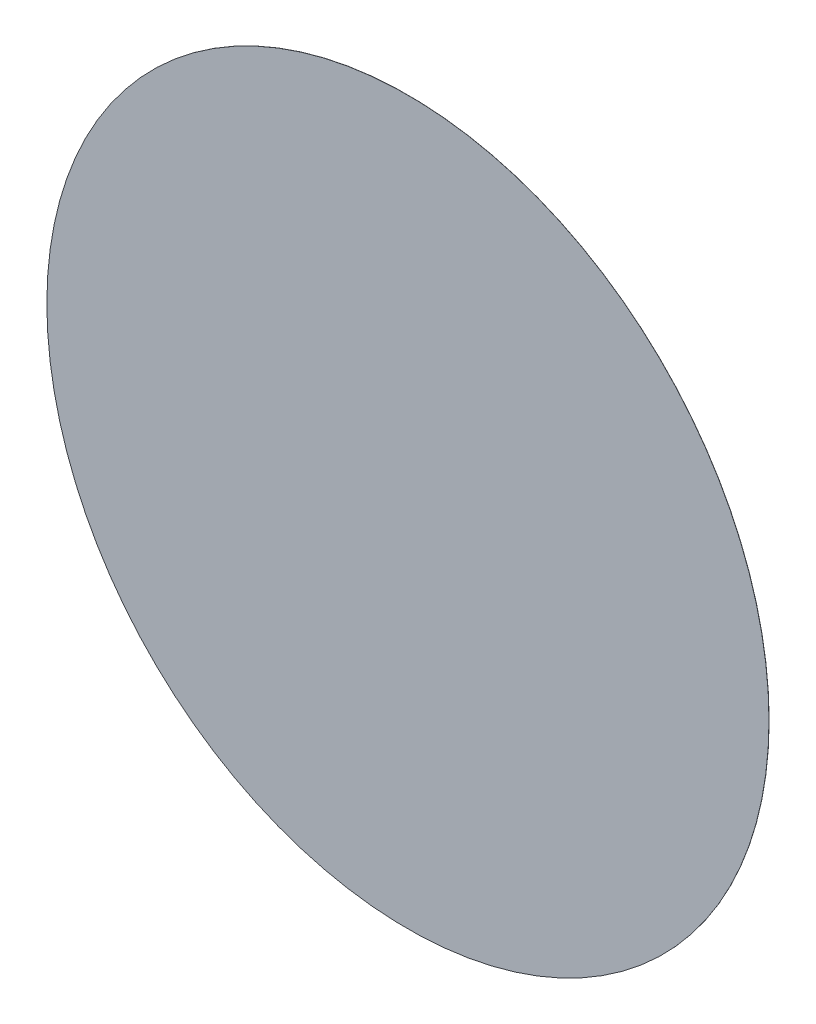
ISO-10303-21;
HEADER;
FILE_DESCRIPTION(('STEP AP214'),'2;1');
FILE_NAME('part.step','',(''),(''),'','','');
FILE_SCHEMA(('AUTOMOTIVE_DESIGN { 1 0 10303 214 1 1 1 1 }'));
ENDSEC;
DATA;
#1=APPLICATION_CONTEXT('core data for automotive mechanical design processes');
#2=APPLICATION_PROTOCOL_DEFINITION('international standard','automotive_design',2000,#1);
#3=PRODUCT_CONTEXT('',#1,'mechanical');
#4=PRODUCT('Part','Part','',(#3));
#5=PRODUCT_RELATED_PRODUCT_CATEGORY('part','',(#4));
#6=PRODUCT_DEFINITION_FORMATION('','',#4);
#7=PRODUCT_DEFINITION_CONTEXT('part definition',#1,'design');
#8=PRODUCT_DEFINITION('design','',#6,#7);
#9=PRODUCT_DEFINITION_SHAPE('','',#8);
#10=(LENGTH_UNIT() NAMED_UNIT(*) SI_UNIT(.MILLI.,.METRE.));
#11=(NAMED_UNIT(*) PLANE_ANGLE_UNIT() SI_UNIT($,.RADIAN.));
#12=(NAMED_UNIT(*) SI_UNIT($,.STERADIAN.) SOLID_ANGLE_UNIT());
#13=UNCERTAINTY_MEASURE_WITH_UNIT(LENGTH_MEASURE(1.E-05),#10,'distance_accuracy_value','');
#14=(GEOMETRIC_REPRESENTATION_CONTEXT(3) GLOBAL_UNCERTAINTY_ASSIGNED_CONTEXT((#13)) GLOBAL_UNIT_ASSIGNED_CONTEXT((#10,
#11,#12)) REPRESENTATION_CONTEXT('',''));
#15=CARTESIAN_POINT('',(0.,0.,0.));
#16=DIRECTION('',(0.,0.,1.));
#17=DIRECTION('',(1.,0.,0.));
#18=AXIS2_PLACEMENT_3D('',#15,#16,#17);
#19=CARTESIAN_POINT('',(-0.0978526525578921,0.103560511093198,0.1));
#20=DIRECTION('',(0.,0.,-1.));
#21=DIRECTION('',(-1.,0.,0.));
#22=AXIS2_PLACEMENT_3D('',#19,#20,#21);
#23=CYLINDRICAL_SURFACE('',#22,250.158771090249);
#24=CARTESIAN_POINT('',(-0.0978526525578921,0.103560511093198,0.1));
#25=DIRECTION('',(0.,0.,1.));
#26=DIRECTION('',(1.,0.,0.));
#27=AXIS2_PLACEMENT_3D('',#24,#25,#26);
#28=CIRCLE('',#27,250.158771090249);
#29=CARTESIAN_POINT('',(250.060918437691,0.103560511093198,0.1));
#30=VERTEX_POINT('',#29);
#31=EDGE_CURVE('E10',#30,#30,#28,.T.);
#32=ORIENTED_EDGE('',*,*,#31,.F.);
#33=EDGE_LOOP('',(#32));
#34=FACE_BOUND('',#33,.T.);
#35=CARTESIAN_POINT('',(-0.0978526525578921,0.103560511093198,0.));
#36=DIRECTION('',(0.,0.,1.));
#37=DIRECTION('',(1.,0.,0.));
#38=AXIS2_PLACEMENT_3D('',#35,#36,#37);
#39=CIRCLE('',#38,250.158771090249);
#40=CARTESIAN_POINT('',(250.060918437691,0.103560511093198,0.));
#41=VERTEX_POINT('',#40);
#42=EDGE_CURVE('E36',#41,#41,#39,.T.);
#43=ORIENTED_EDGE('',*,*,#42,.T.);
#44=EDGE_LOOP('',(#43));
#45=FACE_BOUND('',#44,.T.);
#46=ADVANCED_FACE('F33',(#34,#45),#23,.T.);
#47=CARTESIAN_POINT('',(-0.0978526525578921,0.103560511093198,0.1));
#48=DIRECTION('',(0.,0.,1.));
#49=DIRECTION('',(1.,0.,0.));
#50=AXIS2_PLACEMENT_3D('',#47,#48,#49);
#51=PLANE('',#50);
#52=ORIENTED_EDGE('',*,*,#31,.T.);
#53=EDGE_LOOP('',(#52));
#54=FACE_BOUND('',#53,.T.);
#55=ADVANCED_FACE('F48',(#54),#51,.T.);
#56=CARTESIAN_POINT('',(-0.0978526525578921,0.103560511093198,0.));
#57=DIRECTION('',(0.,0.,1.));
#58=DIRECTION('',(1.,0.,0.));
#59=AXIS2_PLACEMENT_3D('',#56,#57,#58);
#60=PLANE('',#59);
#61=ORIENTED_EDGE('',*,*,#42,.F.);
#62=EDGE_LOOP('',(#61));
#63=FACE_BOUND('',#62,.T.);
#64=ADVANCED_FACE('F46',(#63),#60,.F.);
#65=CLOSED_SHELL('',(#46,#55,#64));
#66=MANIFOLD_SOLID_BREP('B2',#65);
#67=ADVANCED_BREP_SHAPE_REPRESENTATION('',(#18,#66),#14);
#68=SHAPE_DEFINITION_REPRESENTATION(#9,#67);
ENDSEC;
END-ISO-10303-21;
